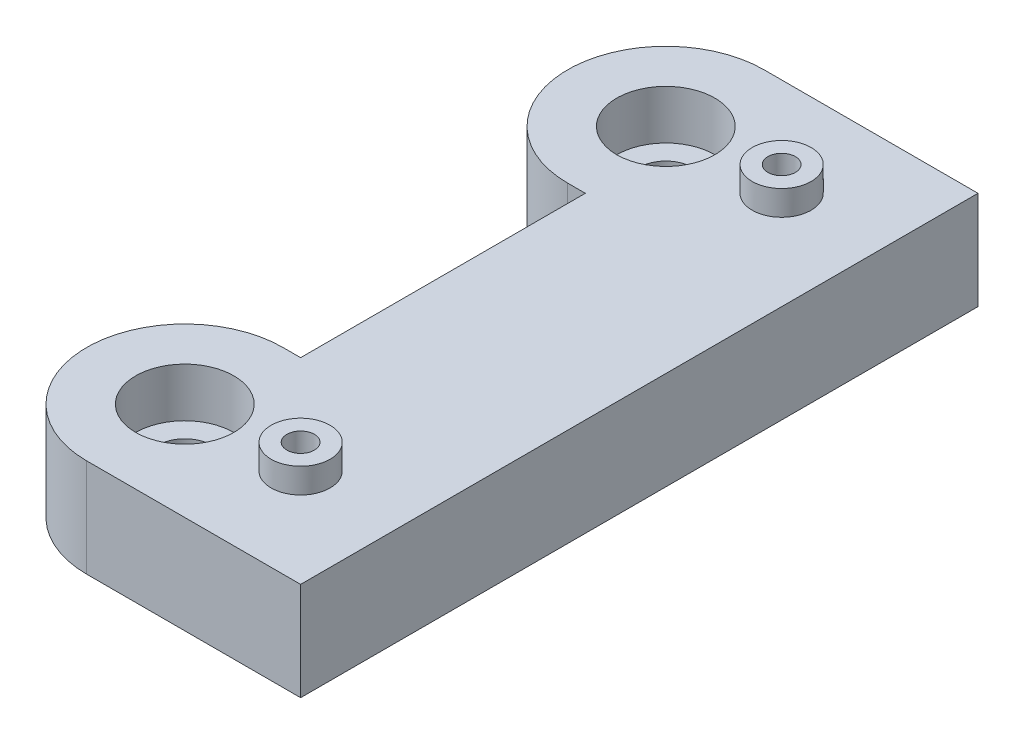
ISO-10303-21;
HEADER;
FILE_DESCRIPTION(('STEP AP214'),'2;1');
FILE_NAME('part.step','',(''),(''),'','','');
FILE_SCHEMA(('AUTOMOTIVE_DESIGN { 1 0 10303 214 1 1 1 1 }'));
ENDSEC;
DATA;
#1=APPLICATION_CONTEXT('core data for automotive mechanical design processes');
#2=APPLICATION_PROTOCOL_DEFINITION('international standard','automotive_design',2000,#1);
#3=PRODUCT_CONTEXT('',#1,'mechanical');
#4=PRODUCT('Part','Part','',(#3));
#5=PRODUCT_RELATED_PRODUCT_CATEGORY('part','',(#4));
#6=PRODUCT_DEFINITION_FORMATION('','',#4);
#7=PRODUCT_DEFINITION_CONTEXT('part definition',#1,'design');
#8=PRODUCT_DEFINITION('design','',#6,#7);
#9=PRODUCT_DEFINITION_SHAPE('','',#8);
#10=(LENGTH_UNIT() NAMED_UNIT(*) SI_UNIT(.MILLI.,.METRE.));
#11=(NAMED_UNIT(*) PLANE_ANGLE_UNIT() SI_UNIT($,.RADIAN.));
#12=(NAMED_UNIT(*) SI_UNIT($,.STERADIAN.) SOLID_ANGLE_UNIT());
#13=UNCERTAINTY_MEASURE_WITH_UNIT(LENGTH_MEASURE(1.E-05),#10,'distance_accuracy_value','');
#14=(GEOMETRIC_REPRESENTATION_CONTEXT(3) GLOBAL_UNCERTAINTY_ASSIGNED_CONTEXT((#13)) GLOBAL_UNIT_ASSIGNED_CONTEXT((#10,
#11,#12)) REPRESENTATION_CONTEXT('',''));
#15=CARTESIAN_POINT('',(0.,0.,0.));
#16=DIRECTION('',(0.,0.,1.));
#17=DIRECTION('',(1.,0.,0.));
#18=AXIS2_PLACEMENT_3D('',#15,#16,#17);
#19=CARTESIAN_POINT('',(-40.8,10.,-24.5));
#20=DIRECTION('',(0.,-1.,0.));
#21=DIRECTION('',(0.,0.,-1.));
#22=AXIS2_PLACEMENT_3D('',#19,#20,#21);
#23=PLANE('',#22);
#24=CARTESIAN_POINT('',(-40.8,10.,24.5));
#25=DIRECTION('',(0.,1.,0.));
#26=DIRECTION('',(0.,0.,1.));
#27=AXIS2_PLACEMENT_3D('',#24,#25,#26);
#28=CIRCLE('',#27,5.);
#29=CARTESIAN_POINT('',(-40.8,10.,29.5));
#30=VERTEX_POINT('',#29);
#31=EDGE_CURVE('E290',#30,#30,#28,.T.);
#32=ORIENTED_EDGE('',*,*,#31,.F.);
#33=EDGE_LOOP('',(#32));
#34=FACE_BOUND('',#33,.T.);
#35=CARTESIAN_POINT('',(-40.8,10.,-24.5));
#36=DIRECTION('',(0.,1.,0.));
#37=DIRECTION('',(0.,0.,1.));
#38=AXIS2_PLACEMENT_3D('',#35,#36,#37);
#39=CIRCLE('',#38,5.);
#40=CARTESIAN_POINT('',(-40.8,10.,-19.5));
#41=VERTEX_POINT('',#40);
#42=EDGE_CURVE('E179',#41,#41,#39,.T.);
#43=ORIENTED_EDGE('',*,*,#42,.F.);
#44=EDGE_LOOP('',(#43));
#45=FACE_BOUND('',#44,.T.);
#46=CARTESIAN_POINT('',(-29.,10.,-24.5));
#47=DIRECTION('',(0.,-1.,0.));
#48=DIRECTION('',(0.,0.,-1.));
#49=AXIS2_PLACEMENT_3D('',#46,#47,#48);
#50=CIRCLE('',#49,3.);
#51=CARTESIAN_POINT('',(-29.,10.,-27.5));
#52=VERTEX_POINT('',#51);
#53=EDGE_CURVE('E43',#52,#52,#50,.F.);
#54=ORIENTED_EDGE('',*,*,#53,.F.);
#55=EDGE_LOOP('',(#54));
#56=FACE_BOUND('',#55,.T.);
#57=CARTESIAN_POINT('',(-40.8,10.,-24.5));
#58=DIRECTION('',(0.,1.,0.));
#59=DIRECTION('',(0.,0.,-1.));
#60=AXIS2_PLACEMENT_3D('',#57,#58,#59);
#61=CIRCLE('',#60,10.);
#62=CARTESIAN_POINT('',(-40.8,10.,-34.5));
#63=VERTEX_POINT('',#62);
#64=CARTESIAN_POINT('',(-40.8,10.,-14.5));
#65=VERTEX_POINT('',#64);
#66=EDGE_CURVE('E148',#63,#65,#61,.T.);
#67=ORIENTED_EDGE('',*,*,#66,.T.);
#68=DIRECTION('',(1.,0.,0.));
#69=VECTOR('',#68,1.);
#70=CARTESIAN_POINT('',(-40.8,10.,-14.5));
#71=LINE('',#70,#69);
#72=CARTESIAN_POINT('',(-39.,10.,-14.5));
#73=VERTEX_POINT('',#72);
#74=EDGE_CURVE('E96',#65,#73,#71,.T.);
#75=ORIENTED_EDGE('',*,*,#74,.T.);
#76=DIRECTION('',(0.,0.,1.));
#77=VECTOR('',#76,1.);
#78=CARTESIAN_POINT('',(-39.,10.,-14.5));
#79=LINE('',#78,#77);
#80=CARTESIAN_POINT('',(-39.,10.,14.5));
#81=VERTEX_POINT('',#80);
#82=EDGE_CURVE('E198',#73,#81,#79,.T.);
#83=ORIENTED_EDGE('',*,*,#82,.T.);
#84=DIRECTION('',(-1.,0.,0.));
#85=VECTOR('',#84,1.);
#86=CARTESIAN_POINT('',(-39.,10.,14.5));
#87=LINE('',#86,#85);
#88=CARTESIAN_POINT('',(-40.8,10.,14.5));
#89=VERTEX_POINT('',#88);
#90=EDGE_CURVE('E200',#81,#89,#87,.T.);
#91=ORIENTED_EDGE('',*,*,#90,.T.);
#92=CARTESIAN_POINT('',(-40.8,10.,24.5));
#93=DIRECTION('',(0.,1.,0.));
#94=DIRECTION('',(0.,0.,1.));
#95=AXIS2_PLACEMENT_3D('',#92,#93,#94);
#96=CIRCLE('',#95,10.);
#97=CARTESIAN_POINT('',(-40.8,10.,34.5));
#98=VERTEX_POINT('',#97);
#99=EDGE_CURVE('E115',#89,#98,#96,.T.);
#100=ORIENTED_EDGE('',*,*,#99,.T.);
#101=DIRECTION('',(1.,0.,0.));
#102=VECTOR('',#101,1.);
#103=CARTESIAN_POINT('',(-19.,10.,34.5));
#104=LINE('',#103,#102);
#105=CARTESIAN_POINT('',(-19.,10.,34.5));
#106=VERTEX_POINT('',#105);
#107=EDGE_CURVE('E109',#98,#106,#104,.T.);
#108=ORIENTED_EDGE('',*,*,#107,.T.);
#109=DIRECTION('',(0.,0.,-1.));
#110=VECTOR('',#109,1.);
#111=CARTESIAN_POINT('',(-19.,10.,-34.5));
#112=LINE('',#111,#110);
#113=CARTESIAN_POINT('',(-19.,10.,-34.5));
#114=VERTEX_POINT('',#113);
#115=EDGE_CURVE('E113',#106,#114,#112,.T.);
#116=ORIENTED_EDGE('',*,*,#115,.T.);
#117=DIRECTION('',(-1.,0.,0.));
#118=VECTOR('',#117,1.);
#119=CARTESIAN_POINT('',(-40.8,10.,-34.5));
#120=LINE('',#119,#118);
#121=EDGE_CURVE('E52',#114,#63,#120,.T.);
#122=ORIENTED_EDGE('',*,*,#121,.T.);
#123=EDGE_LOOP('',(#67,#75,#83,#91,#100,#108,#116,#122));
#124=FACE_BOUND('',#123,.T.);
#125=CARTESIAN_POINT('',(-29.,10.,24.5));
#126=DIRECTION('',(0.,-1.,0.));
#127=DIRECTION('',(0.,0.,-1.));
#128=AXIS2_PLACEMENT_3D('',#125,#126,#127);
#129=CIRCLE('',#128,3.);
#130=CARTESIAN_POINT('',(-29.,10.,21.5));
#131=VERTEX_POINT('',#130);
#132=EDGE_CURVE('E11',#131,#131,#129,.F.);
#133=ORIENTED_EDGE('',*,*,#132,.F.);
#134=EDGE_LOOP('',(#133));
#135=FACE_BOUND('',#134,.T.);
#136=ADVANCED_FACE('F33',(#34,#45,#56,#124,#135),#23,.F.);
#137=CARTESIAN_POINT('',(-40.8,0.,-24.5));
#138=DIRECTION('',(0.,-1.,0.));
#139=DIRECTION('',(0.,0.,-1.));
#140=AXIS2_PLACEMENT_3D('',#137,#138,#139);
#141=PLANE('',#140);
#142=CARTESIAN_POINT('',(-40.8,0.,24.5));
#143=DIRECTION('',(0.,-1.,0.));
#144=DIRECTION('',(0.,0.,-1.));
#145=AXIS2_PLACEMENT_3D('',#142,#143,#144);
#146=CIRCLE('',#145,2.75);
#147=CARTESIAN_POINT('',(-40.8,0.,21.75));
#148=VERTEX_POINT('',#147);
#149=EDGE_CURVE('E37',#148,#148,#146,.T.);
#150=ORIENTED_EDGE('',*,*,#149,.F.);
#151=EDGE_LOOP('',(#150));
#152=FACE_BOUND('',#151,.T.);
#153=CARTESIAN_POINT('',(-40.8,0.,-24.5));
#154=DIRECTION('',(0.,-1.,0.));
#155=DIRECTION('',(0.,0.,-1.));
#156=AXIS2_PLACEMENT_3D('',#153,#154,#155);
#157=CIRCLE('',#156,2.75);
#158=CARTESIAN_POINT('',(-40.8,0.,-27.25));
#159=VERTEX_POINT('',#158);
#160=EDGE_CURVE('E164',#159,#159,#157,.T.);
#161=ORIENTED_EDGE('',*,*,#160,.F.);
#162=EDGE_LOOP('',(#161));
#163=FACE_BOUND('',#162,.T.);
#164=CARTESIAN_POINT('',(-29.,0.,24.5));
#165=DIRECTION('',(0.,1.,0.));
#166=DIRECTION('',(0.,0.,1.));
#167=AXIS2_PLACEMENT_3D('',#164,#165,#166);
#168=CIRCLE('',#167,1.4);
#169=CARTESIAN_POINT('',(-29.,0.,25.9));
#170=VERTEX_POINT('',#169);
#171=EDGE_CURVE('E137',#170,#170,#168,.T.);
#172=ORIENTED_EDGE('',*,*,#171,.T.);
#173=EDGE_LOOP('',(#172));
#174=FACE_BOUND('',#173,.T.);
#175=CARTESIAN_POINT('',(-40.8,0.,-24.5));
#176=DIRECTION('',(0.,1.,0.));
#177=DIRECTION('',(0.,0.,-1.));
#178=AXIS2_PLACEMENT_3D('',#175,#176,#177);
#179=CIRCLE('',#178,10.);
#180=CARTESIAN_POINT('',(-40.8,0.,-34.5));
#181=VERTEX_POINT('',#180);
#182=CARTESIAN_POINT('',(-40.8,0.,-14.5));
#183=VERTEX_POINT('',#182);
#184=EDGE_CURVE('E133',#181,#183,#179,.T.);
#185=ORIENTED_EDGE('',*,*,#184,.F.);
#186=DIRECTION('',(-1.,0.,0.));
#187=VECTOR('',#186,1.);
#188=CARTESIAN_POINT('',(-40.8,0.,-34.5));
#189=LINE('',#188,#187);
#190=CARTESIAN_POINT('',(-19.,0.,-34.5));
#191=VERTEX_POINT('',#190);
#192=EDGE_CURVE('E87',#191,#181,#189,.T.);
#193=ORIENTED_EDGE('',*,*,#192,.F.);
#194=DIRECTION('',(0.,0.,-1.));
#195=VECTOR('',#194,1.);
#196=CARTESIAN_POINT('',(-19.,0.,-34.5));
#197=LINE('',#196,#195);
#198=CARTESIAN_POINT('',(-19.,0.,34.5));
#199=VERTEX_POINT('',#198);
#200=EDGE_CURVE('E81',#199,#191,#197,.T.);
#201=ORIENTED_EDGE('',*,*,#200,.F.);
#202=DIRECTION('',(1.,0.,0.));
#203=VECTOR('',#202,1.);
#204=CARTESIAN_POINT('',(-19.,0.,34.5));
#205=LINE('',#204,#203);
#206=CARTESIAN_POINT('',(-40.8,0.,34.5));
#207=VERTEX_POINT('',#206);
#208=EDGE_CURVE('E123',#207,#199,#205,.T.);
#209=ORIENTED_EDGE('',*,*,#208,.F.);
#210=CARTESIAN_POINT('',(-40.8,0.,24.5));
#211=DIRECTION('',(0.,1.,0.));
#212=DIRECTION('',(0.,0.,1.));
#213=AXIS2_PLACEMENT_3D('',#210,#211,#212);
#214=CIRCLE('',#213,10.);
#215=CARTESIAN_POINT('',(-40.8,0.,14.5));
#216=VERTEX_POINT('',#215);
#217=EDGE_CURVE('E143',#216,#207,#214,.T.);
#218=ORIENTED_EDGE('',*,*,#217,.F.);
#219=DIRECTION('',(-1.,0.,0.));
#220=VECTOR('',#219,1.);
#221=CARTESIAN_POINT('',(-39.,0.,14.5));
#222=LINE('',#221,#220);
#223=CARTESIAN_POINT('',(-39.,0.,14.5));
#224=VERTEX_POINT('',#223);
#225=EDGE_CURVE('E141',#224,#216,#222,.T.);
#226=ORIENTED_EDGE('',*,*,#225,.F.);
#227=DIRECTION('',(0.,0.,1.));
#228=VECTOR('',#227,1.);
#229=CARTESIAN_POINT('',(-39.,0.,-14.5));
#230=LINE('',#229,#228);
#231=CARTESIAN_POINT('',(-39.,0.,-14.5));
#232=VERTEX_POINT('',#231);
#233=EDGE_CURVE('E139',#232,#224,#230,.T.);
#234=ORIENTED_EDGE('',*,*,#233,.F.);
#235=DIRECTION('',(1.,0.,0.));
#236=VECTOR('',#235,1.);
#237=CARTESIAN_POINT('',(-40.8,0.,-14.5));
#238=LINE('',#237,#236);
#239=EDGE_CURVE('E136',#183,#232,#238,.T.);
#240=ORIENTED_EDGE('',*,*,#239,.F.);
#241=EDGE_LOOP('',(#185,#193,#201,#209,#218,#226,#234,#240));
#242=FACE_BOUND('',#241,.T.);
#243=CARTESIAN_POINT('',(-29.,0.,-24.5));
#244=DIRECTION('',(0.,1.,0.));
#245=DIRECTION('',(0.,0.,1.));
#246=AXIS2_PLACEMENT_3D('',#243,#244,#245);
#247=CIRCLE('',#246,1.4);
#248=CARTESIAN_POINT('',(-29.,0.,-23.1));
#249=VERTEX_POINT('',#248);
#250=EDGE_CURVE('E191',#249,#249,#247,.T.);
#251=ORIENTED_EDGE('',*,*,#250,.T.);
#252=EDGE_LOOP('',(#251));
#253=FACE_BOUND('',#252,.T.);
#254=ADVANCED_FACE('F213',(#152,#163,#174,#242,#253),#141,.T.);
#255=CARTESIAN_POINT('',(-40.8,10.,-24.5));
#256=DIRECTION('',(0.,-1.,0.));
#257=DIRECTION('',(0.,0.,-1.));
#258=AXIS2_PLACEMENT_3D('',#255,#256,#257);
#259=CYLINDRICAL_SURFACE('',#258,10.);
#260=ORIENTED_EDGE('',*,*,#184,.T.);
#261=DIRECTION('',(0.,-1.,0.));
#262=VECTOR('',#261,1.);
#263=CARTESIAN_POINT('',(-40.8,10.,-14.5));
#264=LINE('',#263,#262);
#265=EDGE_CURVE('E161',#65,#183,#264,.T.);
#266=ORIENTED_EDGE('',*,*,#265,.F.);
#267=ORIENTED_EDGE('',*,*,#66,.F.);
#268=DIRECTION('',(0.,-1.,0.));
#269=VECTOR('',#268,1.);
#270=CARTESIAN_POINT('',(-40.8,10.,-34.5));
#271=LINE('',#270,#269);
#272=EDGE_CURVE('E129',#63,#181,#271,.T.);
#273=ORIENTED_EDGE('',*,*,#272,.T.);
#274=EDGE_LOOP('',(#260,#266,#267,#273));
#275=FACE_BOUND('',#274,.T.);
#276=ADVANCED_FACE('F35',(#275),#259,.T.);
#277=CARTESIAN_POINT('',(-40.8,10.,-14.5));
#278=DIRECTION('',(0.,0.,-1.));
#279=DIRECTION('',(-1.,0.,0.));
#280=AXIS2_PLACEMENT_3D('',#277,#278,#279);
#281=PLANE('',#280);
#282=ORIENTED_EDGE('',*,*,#239,.T.);
#283=DIRECTION('',(0.,-1.,0.));
#284=VECTOR('',#283,1.);
#285=CARTESIAN_POINT('',(-39.,10.,-14.5));
#286=LINE('',#285,#284);
#287=EDGE_CURVE('E158',#73,#232,#286,.T.);
#288=ORIENTED_EDGE('',*,*,#287,.F.);
#289=ORIENTED_EDGE('',*,*,#74,.F.);
#290=ORIENTED_EDGE('',*,*,#265,.T.);
#291=EDGE_LOOP('',(#282,#288,#289,#290));
#292=FACE_BOUND('',#291,.T.);
#293=ADVANCED_FACE('F404',(#292),#281,.F.);
#294=CARTESIAN_POINT('',(-39.,10.,-14.5));
#295=DIRECTION('',(1.,0.,0.));
#296=DIRECTION('',(0.,0.,-1.));
#297=AXIS2_PLACEMENT_3D('',#294,#295,#296);
#298=PLANE('',#297);
#299=ORIENTED_EDGE('',*,*,#233,.T.);
#300=DIRECTION('',(0.,-1.,0.));
#301=VECTOR('',#300,1.);
#302=CARTESIAN_POINT('',(-39.,10.,14.5));
#303=LINE('',#302,#301);
#304=EDGE_CURVE('E155',#81,#224,#303,.T.);
#305=ORIENTED_EDGE('',*,*,#304,.F.);
#306=ORIENTED_EDGE('',*,*,#82,.F.);
#307=ORIENTED_EDGE('',*,*,#287,.T.);
#308=EDGE_LOOP('',(#299,#305,#306,#307));
#309=FACE_BOUND('',#308,.T.);
#310=ADVANCED_FACE('F395',(#309),#298,.F.);
#311=CARTESIAN_POINT('',(-39.,10.,14.5));
#312=DIRECTION('',(0.,0.,1.));
#313=DIRECTION('',(1.,0.,0.));
#314=AXIS2_PLACEMENT_3D('',#311,#312,#313);
#315=PLANE('',#314);
#316=ORIENTED_EDGE('',*,*,#225,.T.);
#317=DIRECTION('',(0.,-1.,0.));
#318=VECTOR('',#317,1.);
#319=CARTESIAN_POINT('',(-40.8,10.,14.5));
#320=LINE('',#319,#318);
#321=EDGE_CURVE('E152',#89,#216,#320,.T.);
#322=ORIENTED_EDGE('',*,*,#321,.F.);
#323=ORIENTED_EDGE('',*,*,#90,.F.);
#324=ORIENTED_EDGE('',*,*,#304,.T.);
#325=EDGE_LOOP('',(#316,#322,#323,#324));
#326=FACE_BOUND('',#325,.T.);
#327=ADVANCED_FACE('F206',(#326),#315,.F.);
#328=CARTESIAN_POINT('',(-40.8,10.,24.5));
#329=DIRECTION('',(0.,-1.,0.));
#330=DIRECTION('',(0.,0.,-1.));
#331=AXIS2_PLACEMENT_3D('',#328,#329,#330);
#332=CYLINDRICAL_SURFACE('',#331,10.);
#333=ORIENTED_EDGE('',*,*,#217,.T.);
#334=DIRECTION('',(0.,-1.,0.));
#335=VECTOR('',#334,1.);
#336=CARTESIAN_POINT('',(-40.8,10.,34.5));
#337=LINE('',#336,#335);
#338=EDGE_CURVE('E124',#98,#207,#337,.T.);
#339=ORIENTED_EDGE('',*,*,#338,.F.);
#340=ORIENTED_EDGE('',*,*,#99,.F.);
#341=ORIENTED_EDGE('',*,*,#321,.T.);
#342=EDGE_LOOP('',(#333,#339,#340,#341));
#343=FACE_BOUND('',#342,.T.);
#344=ADVANCED_FACE('F210',(#343),#332,.T.);
#345=CARTESIAN_POINT('',(-19.,10.,34.5));
#346=DIRECTION('',(0.,0.,-1.));
#347=DIRECTION('',(-1.,0.,0.));
#348=AXIS2_PLACEMENT_3D('',#345,#346,#347);
#349=PLANE('',#348);
#350=ORIENTED_EDGE('',*,*,#208,.T.);
#351=DIRECTION('',(0.,-1.,0.));
#352=VECTOR('',#351,1.);
#353=CARTESIAN_POINT('',(-19.,10.,34.5));
#354=LINE('',#353,#352);
#355=EDGE_CURVE('E120',#106,#199,#354,.T.);
#356=ORIENTED_EDGE('',*,*,#355,.F.);
#357=ORIENTED_EDGE('',*,*,#107,.F.);
#358=ORIENTED_EDGE('',*,*,#338,.T.);
#359=EDGE_LOOP('',(#350,#356,#357,#358));
#360=FACE_BOUND('',#359,.T.);
#361=ADVANCED_FACE('F121',(#360),#349,.F.);
#362=CARTESIAN_POINT('',(-19.,10.,-34.5));
#363=DIRECTION('',(-1.,0.,0.));
#364=DIRECTION('',(0.,0.,1.));
#365=AXIS2_PLACEMENT_3D('',#362,#363,#364);
#366=PLANE('',#365);
#367=ORIENTED_EDGE('',*,*,#200,.T.);
#368=DIRECTION('',(0.,-1.,0.));
#369=VECTOR('',#368,1.);
#370=CARTESIAN_POINT('',(-19.,10.,-34.5));
#371=LINE('',#370,#369);
#372=EDGE_CURVE('E125',#114,#191,#371,.T.);
#373=ORIENTED_EDGE('',*,*,#372,.F.);
#374=ORIENTED_EDGE('',*,*,#115,.F.);
#375=ORIENTED_EDGE('',*,*,#355,.T.);
#376=EDGE_LOOP('',(#367,#373,#374,#375));
#377=FACE_BOUND('',#376,.T.);
#378=ADVANCED_FACE('F127',(#377),#366,.F.);
#379=CARTESIAN_POINT('',(-40.8,10.,-34.5));
#380=DIRECTION('',(0.,0.,1.));
#381=DIRECTION('',(1.,0.,0.));
#382=AXIS2_PLACEMENT_3D('',#379,#380,#381);
#383=PLANE('',#382);
#384=ORIENTED_EDGE('',*,*,#192,.T.);
#385=ORIENTED_EDGE('',*,*,#272,.F.);
#386=ORIENTED_EDGE('',*,*,#121,.F.);
#387=ORIENTED_EDGE('',*,*,#372,.T.);
#388=EDGE_LOOP('',(#384,#385,#386,#387));
#389=FACE_BOUND('',#388,.T.);
#390=ADVANCED_FACE('F219',(#389),#383,.F.);
#391=CARTESIAN_POINT('',(-29.,10.,24.5));
#392=DIRECTION('',(0.,-1.,0.));
#393=DIRECTION('',(0.,0.,-1.));
#394=AXIS2_PLACEMENT_3D('',#391,#392,#393);
#395=CYLINDRICAL_SURFACE('',#394,1.4);
#396=ORIENTED_EDGE('',*,*,#171,.F.);
#397=EDGE_LOOP('',(#396));
#398=FACE_BOUND('',#397,.T.);
#399=CARTESIAN_POINT('',(-29.,12.54,24.5));
#400=DIRECTION('',(0.,1.,0.));
#401=DIRECTION('',(0.,0.,1.));
#402=AXIS2_PLACEMENT_3D('',#399,#400,#401);
#403=CIRCLE('',#402,1.4);
#404=CARTESIAN_POINT('',(-29.,12.54,25.9));
#405=VERTEX_POINT('',#404);
#406=EDGE_CURVE('E166',#405,#405,#403,.T.);
#407=ORIENTED_EDGE('',*,*,#406,.T.);
#408=EDGE_LOOP('',(#407));
#409=FACE_BOUND('',#408,.T.);
#410=ADVANCED_FACE('F221',(#398,#409),#395,.F.);
#411=CARTESIAN_POINT('',(-29.,10.,-24.5));
#412=DIRECTION('',(0.,-1.,0.));
#413=DIRECTION('',(0.,0.,-1.));
#414=AXIS2_PLACEMENT_3D('',#411,#412,#413);
#415=CYLINDRICAL_SURFACE('',#414,1.4);
#416=ORIENTED_EDGE('',*,*,#250,.F.);
#417=EDGE_LOOP('',(#416));
#418=FACE_BOUND('',#417,.T.);
#419=CARTESIAN_POINT('',(-29.,12.54,-24.5));
#420=DIRECTION('',(0.,1.,0.));
#421=DIRECTION('',(0.,0.,1.));
#422=AXIS2_PLACEMENT_3D('',#419,#420,#421);
#423=CIRCLE('',#422,1.4);
#424=CARTESIAN_POINT('',(-29.,12.54,-23.1));
#425=VERTEX_POINT('',#424);
#426=EDGE_CURVE('E185',#425,#425,#423,.T.);
#427=ORIENTED_EDGE('',*,*,#426,.T.);
#428=EDGE_LOOP('',(#427));
#429=FACE_BOUND('',#428,.T.);
#430=ADVANCED_FACE('F227',(#418,#429),#415,.F.);
#431=CARTESIAN_POINT('',(-29.,12.54,-24.5));
#432=DIRECTION('',(0.,1.,0.));
#433=DIRECTION('',(0.,0.,1.));
#434=AXIS2_PLACEMENT_3D('',#431,#432,#433);
#435=PLANE('',#434);
#436=CARTESIAN_POINT('',(-29.,12.54,-24.5));
#437=DIRECTION('',(0.,1.,0.));
#438=DIRECTION('',(0.,0.,1.));
#439=AXIS2_PLACEMENT_3D('',#436,#437,#438);
#440=CIRCLE('',#439,3.);
#441=CARTESIAN_POINT('',(-29.,12.54,-21.5));
#442=VERTEX_POINT('',#441);
#443=EDGE_CURVE('E188',#442,#442,#440,.T.);
#444=ORIENTED_EDGE('',*,*,#443,.T.);
#445=EDGE_LOOP('',(#444));
#446=FACE_BOUND('',#445,.T.);
#447=ORIENTED_EDGE('',*,*,#426,.F.);
#448=EDGE_LOOP('',(#447));
#449=FACE_BOUND('',#448,.T.);
#450=ADVANCED_FACE('F244',(#446,#449),#435,.T.);
#451=CARTESIAN_POINT('',(-29.,12.54,-24.5));
#452=DIRECTION('',(0.,-1.,0.));
#453=DIRECTION('',(0.,0.,-1.));
#454=AXIS2_PLACEMENT_3D('',#451,#452,#453);
#455=CYLINDRICAL_SURFACE('',#454,3.);
#456=ORIENTED_EDGE('',*,*,#443,.F.);
#457=EDGE_LOOP('',(#456));
#458=FACE_BOUND('',#457,.T.);
#459=ORIENTED_EDGE('',*,*,#53,.T.);
#460=EDGE_LOOP('',(#459));
#461=FACE_BOUND('',#460,.T.);
#462=ADVANCED_FACE('F246',(#458,#461),#455,.T.);
#463=CARTESIAN_POINT('',(-29.,12.54,24.5));
#464=DIRECTION('',(0.,1.,0.));
#465=DIRECTION('',(0.,0.,1.));
#466=AXIS2_PLACEMENT_3D('',#463,#464,#465);
#467=PLANE('',#466);
#468=CARTESIAN_POINT('',(-29.,12.54,24.5));
#469=DIRECTION('',(0.,1.,0.));
#470=DIRECTION('',(0.,0.,1.));
#471=AXIS2_PLACEMENT_3D('',#468,#469,#470);
#472=CIRCLE('',#471,3.);
#473=CARTESIAN_POINT('',(-29.,12.54,27.5));
#474=VERTEX_POINT('',#473);
#475=EDGE_CURVE('E171',#474,#474,#472,.T.);
#476=ORIENTED_EDGE('',*,*,#475,.T.);
#477=EDGE_LOOP('',(#476));
#478=FACE_BOUND('',#477,.T.);
#479=ORIENTED_EDGE('',*,*,#406,.F.);
#480=EDGE_LOOP('',(#479));
#481=FACE_BOUND('',#480,.T.);
#482=ADVANCED_FACE('F249',(#478,#481),#467,.T.);
#483=CARTESIAN_POINT('',(-29.,12.54,24.5));
#484=DIRECTION('',(0.,-1.,0.));
#485=DIRECTION('',(0.,0.,-1.));
#486=AXIS2_PLACEMENT_3D('',#483,#484,#485);
#487=CYLINDRICAL_SURFACE('',#486,3.);
#488=ORIENTED_EDGE('',*,*,#475,.F.);
#489=EDGE_LOOP('',(#488));
#490=FACE_BOUND('',#489,.T.);
#491=ORIENTED_EDGE('',*,*,#132,.T.);
#492=EDGE_LOOP('',(#491));
#493=FACE_BOUND('',#492,.T.);
#494=ADVANCED_FACE('F254',(#490,#493),#487,.T.);
#495=CARTESIAN_POINT('',(-40.8,10.,-24.5));
#496=DIRECTION('',(0.,1.,0.));
#497=DIRECTION('',(0.,0.,1.));
#498=AXIS2_PLACEMENT_3D('',#495,#496,#497);
#499=CYLINDRICAL_SURFACE('',#498,2.75);
#500=ORIENTED_EDGE('',*,*,#160,.T.);
#501=EDGE_LOOP('',(#500));
#502=FACE_BOUND('',#501,.T.);
#503=CARTESIAN_POINT('',(-40.8,5.,-24.5));
#504=DIRECTION('',(0.,1.,0.));
#505=DIRECTION('',(0.,0.,1.));
#506=AXIS2_PLACEMENT_3D('',#503,#504,#505);
#507=CIRCLE('',#506,2.75);
#508=CARTESIAN_POINT('',(-40.8,5.,-21.75));
#509=VERTEX_POINT('',#508);
#510=EDGE_CURVE('E167',#509,#509,#507,.T.);
#511=ORIENTED_EDGE('',*,*,#510,.T.);
#512=EDGE_LOOP('',(#511));
#513=FACE_BOUND('',#512,.T.);
#514=ADVANCED_FACE('F257',(#502,#513),#499,.F.);
#515=CARTESIAN_POINT('',(-38.05,5.,-24.5));
#516=DIRECTION('',(0.,-1.,0.));
#517=DIRECTION('',(0.,0.,-1.));
#518=AXIS2_PLACEMENT_3D('',#515,#516,#517);
#519=PLANE('',#518);
#520=ORIENTED_EDGE('',*,*,#510,.F.);
#521=EDGE_LOOP('',(#520));
#522=FACE_BOUND('',#521,.T.);
#523=CARTESIAN_POINT('',(-40.8,5.,-24.5));
#524=DIRECTION('',(0.,1.,0.));
#525=DIRECTION('',(0.,0.,1.));
#526=AXIS2_PLACEMENT_3D('',#523,#524,#525);
#527=CIRCLE('',#526,5.);
#528=CARTESIAN_POINT('',(-40.8,5.,-19.5));
#529=VERTEX_POINT('',#528);
#530=EDGE_CURVE('E174',#529,#529,#527,.T.);
#531=ORIENTED_EDGE('',*,*,#530,.T.);
#532=EDGE_LOOP('',(#531));
#533=FACE_BOUND('',#532,.T.);
#534=ADVANCED_FACE('F264',(#522,#533),#519,.F.);
#535=CARTESIAN_POINT('',(-40.8,10.,-24.5));
#536=DIRECTION('',(0.,1.,0.));
#537=DIRECTION('',(0.,0.,1.));
#538=AXIS2_PLACEMENT_3D('',#535,#536,#537);
#539=CYLINDRICAL_SURFACE('',#538,5.);
#540=ORIENTED_EDGE('',*,*,#530,.F.);
#541=EDGE_LOOP('',(#540));
#542=FACE_BOUND('',#541,.T.);
#543=ORIENTED_EDGE('',*,*,#42,.T.);
#544=EDGE_LOOP('',(#543));
#545=FACE_BOUND('',#544,.T.);
#546=ADVANCED_FACE('F267',(#542,#545),#539,.F.);
#547=CARTESIAN_POINT('',(-40.8,10.,24.5));
#548=DIRECTION('',(0.,1.,0.));
#549=DIRECTION('',(0.,0.,1.));
#550=AXIS2_PLACEMENT_3D('',#547,#548,#549);
#551=CYLINDRICAL_SURFACE('',#550,2.75);
#552=ORIENTED_EDGE('',*,*,#149,.T.);
#553=EDGE_LOOP('',(#552));
#554=FACE_BOUND('',#553,.T.);
#555=CARTESIAN_POINT('',(-40.8,5.,24.5));
#556=DIRECTION('',(0.,1.,0.));
#557=DIRECTION('',(0.,0.,1.));
#558=AXIS2_PLACEMENT_3D('',#555,#556,#557);
#559=CIRCLE('',#558,2.75);
#560=CARTESIAN_POINT('',(-40.8,5.,27.25));
#561=VERTEX_POINT('',#560);
#562=EDGE_CURVE('E292',#561,#561,#559,.T.);
#563=ORIENTED_EDGE('',*,*,#562,.T.);
#564=EDGE_LOOP('',(#563));
#565=FACE_BOUND('',#564,.T.);
#566=ADVANCED_FACE('F271',(#554,#565),#551,.F.);
#567=CARTESIAN_POINT('',(-38.05,5.,24.5));
#568=DIRECTION('',(0.,-1.,0.));
#569=DIRECTION('',(0.,0.,-1.));
#570=AXIS2_PLACEMENT_3D('',#567,#568,#569);
#571=PLANE('',#570);
#572=ORIENTED_EDGE('',*,*,#562,.F.);
#573=EDGE_LOOP('',(#572));
#574=FACE_BOUND('',#573,.T.);
#575=CARTESIAN_POINT('',(-40.8,5.,24.5));
#576=DIRECTION('',(0.,1.,0.));
#577=DIRECTION('',(0.,0.,1.));
#578=AXIS2_PLACEMENT_3D('',#575,#576,#577);
#579=CIRCLE('',#578,5.);
#580=CARTESIAN_POINT('',(-40.8,5.,29.5));
#581=VERTEX_POINT('',#580);
#582=EDGE_CURVE('E288',#581,#581,#579,.T.);
#583=ORIENTED_EDGE('',*,*,#582,.T.);
#584=EDGE_LOOP('',(#583));
#585=FACE_BOUND('',#584,.T.);
#586=ADVANCED_FACE('F275',(#574,#585),#571,.F.);
#587=CARTESIAN_POINT('',(-40.8,10.,24.5));
#588=DIRECTION('',(0.,1.,0.));
#589=DIRECTION('',(0.,0.,1.));
#590=AXIS2_PLACEMENT_3D('',#587,#588,#589);
#591=CYLINDRICAL_SURFACE('',#590,5.);
#592=ORIENTED_EDGE('',*,*,#582,.F.);
#593=EDGE_LOOP('',(#592));
#594=FACE_BOUND('',#593,.T.);
#595=ORIENTED_EDGE('',*,*,#31,.T.);
#596=EDGE_LOOP('',(#595));
#597=FACE_BOUND('',#596,.T.);
#598=ADVANCED_FACE('F279',(#594,#597),#591,.F.);
#599=CLOSED_SHELL('',(#136,#254,#276,#293,#310,#327,#344,#361,#378,#390,#410,#430,#450,#462,
#482,#494,#514,#534,#546,#566,#586,#598));
#600=MANIFOLD_SOLID_BREP('B2',#599);
#601=ADVANCED_BREP_SHAPE_REPRESENTATION('',(#18,#600),#14);
#602=SHAPE_DEFINITION_REPRESENTATION(#9,#601);
ENDSEC;
END-ISO-10303-21;
